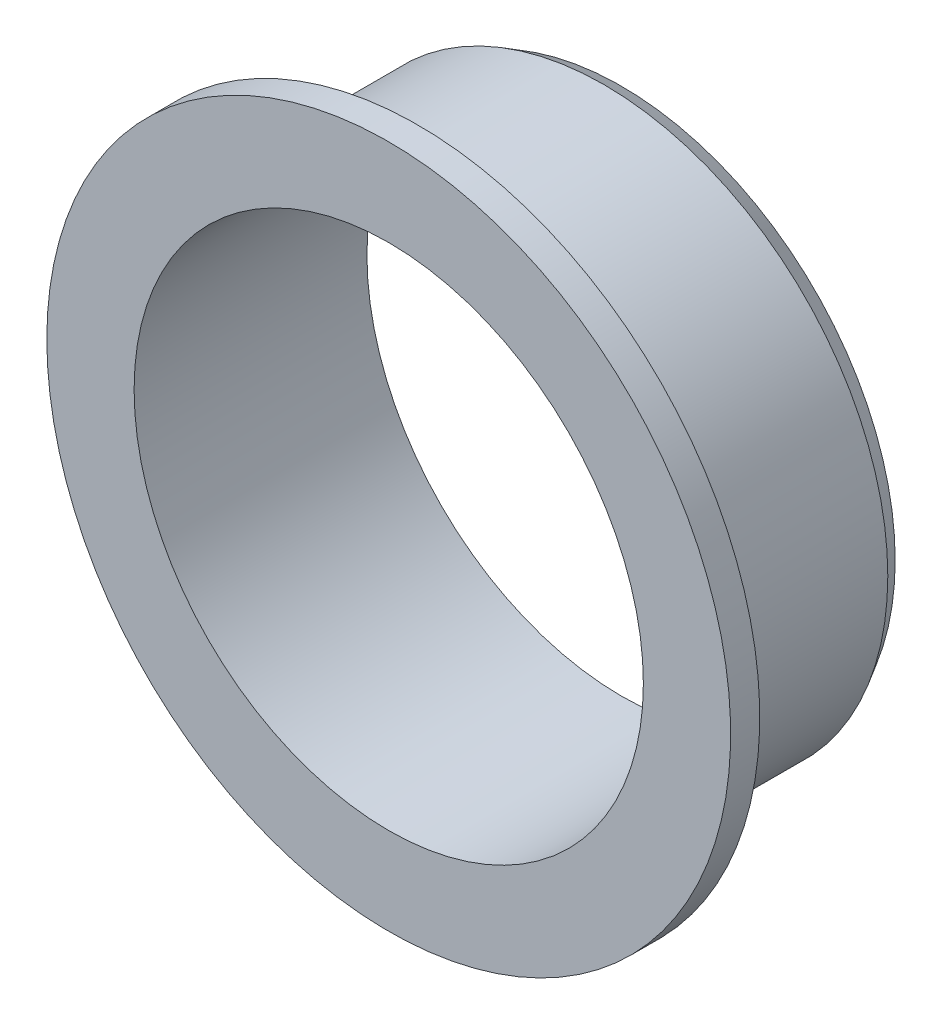
ISO-10303-21;
HEADER;
FILE_DESCRIPTION(('STEP AP214'),'2;1');
FILE_NAME('part.step','',(''),(''),'','','');
FILE_SCHEMA(('AUTOMOTIVE_DESIGN { 1 0 10303 214 1 1 1 1 }'));
ENDSEC;
DATA;
#1=APPLICATION_CONTEXT('core data for automotive mechanical design processes');
#2=APPLICATION_PROTOCOL_DEFINITION('international standard','automotive_design',2000,#1);
#3=PRODUCT_CONTEXT('',#1,'mechanical');
#4=PRODUCT('Part','Part','',(#3));
#5=PRODUCT_RELATED_PRODUCT_CATEGORY('part','',(#4));
#6=PRODUCT_DEFINITION_FORMATION('','',#4);
#7=PRODUCT_DEFINITION_CONTEXT('part definition',#1,'design');
#8=PRODUCT_DEFINITION('design','',#6,#7);
#9=PRODUCT_DEFINITION_SHAPE('','',#8);
#10=(LENGTH_UNIT() NAMED_UNIT(*) SI_UNIT(.MILLI.,.METRE.));
#11=(NAMED_UNIT(*) PLANE_ANGLE_UNIT() SI_UNIT($,.RADIAN.));
#12=(NAMED_UNIT(*) SI_UNIT($,.STERADIAN.) SOLID_ANGLE_UNIT());
#13=UNCERTAINTY_MEASURE_WITH_UNIT(LENGTH_MEASURE(1.E-05),#10,'distance_accuracy_value','');
#14=(GEOMETRIC_REPRESENTATION_CONTEXT(3) GLOBAL_UNCERTAINTY_ASSIGNED_CONTEXT((#13)) GLOBAL_UNIT_ASSIGNED_CONTEXT((#10,
#11,#12)) REPRESENTATION_CONTEXT('',''));
#15=CARTESIAN_POINT('',(0.,0.,0.));
#16=DIRECTION('',(0.,0.,1.));
#17=DIRECTION('',(1.,0.,0.));
#18=AXIS2_PLACEMENT_3D('',#15,#16,#17);
#19=CARTESIAN_POINT('',(-196.682719320137,-420.602297752566,-809.23578652296));
#20=DIRECTION('',(0.,0.,-1.));
#21=DIRECTION('',(-1.,0.,0.));
#22=AXIS2_PLACEMENT_3D('',#19,#20,#21);
#23=TOROIDAL_SURFACE('',#22,20.,0.500000000000007);
#24=CARTESIAN_POINT('',(-196.682719320137,-420.602297752566,-808.73578652296));
#25=DIRECTION('',(0.,0.,-1.));
#26=DIRECTION('',(-1.,0.,0.));
#27=AXIS2_PLACEMENT_3D('',#24,#25,#26);
#28=CIRCLE('',#27,20.);
#29=CARTESIAN_POINT('',(-176.682719320137,-420.602297752566,-808.73578652296));
#30=VERTEX_POINT('',#29);
#31=CARTESIAN_POINT('',(-216.682719320137,-420.602297752566,-808.73578652296));
#32=VERTEX_POINT('',#31);
#33=EDGE_CURVE('E38',#30,#32,#28,.F.);
#34=ORIENTED_EDGE('',*,*,#33,.F.);
#35=CARTESIAN_POINT('',(-196.682719320137,-420.602297752566,-808.73578652296));
#36=DIRECTION('',(0.,0.,-1.));
#37=DIRECTION('',(1.,0.,0.));
#38=AXIS2_PLACEMENT_3D('',#35,#36,#37);
#39=CIRCLE('',#38,20.);
#40=EDGE_CURVE('E35',#32,#30,#39,.F.);
#41=ORIENTED_EDGE('',*,*,#40,.F.);
#42=EDGE_LOOP('',(#34,#41));
#43=FACE_BOUND('',#42,.T.);
#44=CARTESIAN_POINT('',(-196.682719320137,-420.602297752566,-809.23578652296));
#45=DIRECTION('',(0.,0.,-1.));
#46=DIRECTION('',(-1.,0.,0.));
#47=AXIS2_PLACEMENT_3D('',#44,#45,#46);
#48=CIRCLE('',#47,19.5);
#49=CARTESIAN_POINT('',(-216.182719320137,-420.602297752566,-809.23578652296));
#50=VERTEX_POINT('',#49);
#51=EDGE_CURVE('E44',#50,#50,#48,.T.);
#52=ORIENTED_EDGE('',*,*,#51,.F.);
#53=EDGE_LOOP('',(#52));
#54=FACE_BOUND('',#53,.T.);
#55=ADVANCED_FACE('F17',(#43,#54),#23,.F.);
#56=CARTESIAN_POINT('',(-218.432719320137,-420.602297752566,-808.735786522959));
#57=DIRECTION('',(0.,0.,-1.));
#58=DIRECTION('',(-1.,0.,0.));
#59=AXIS2_PLACEMENT_3D('',#56,#57,#58);
#60=PLANE('',#59);
#61=ORIENTED_EDGE('',*,*,#40,.T.);
#62=ORIENTED_EDGE('',*,*,#33,.T.);
#63=EDGE_LOOP('',(#61,#62));
#64=FACE_BOUND('',#63,.T.);
#65=CARTESIAN_POINT('',(-196.682719320137,-420.602297752566,-808.735786522959));
#66=DIRECTION('',(0.,0.,-1.));
#67=DIRECTION('',(-1.,0.,0.));
#68=AXIS2_PLACEMENT_3D('',#65,#66,#67);
#69=CIRCLE('',#68,23.5);
#70=CARTESIAN_POINT('',(-220.182719320137,-420.602297752566,-808.735786522959));
#71=VERTEX_POINT('',#70);
#72=EDGE_CURVE('E49',#71,#71,#69,.F.);
#73=ORIENTED_EDGE('',*,*,#72,.F.);
#74=EDGE_LOOP('',(#73));
#75=FACE_BOUND('',#74,.T.);
#76=ADVANCED_FACE('F40',(#64,#75),#60,.T.);
#77=CARTESIAN_POINT('',(-196.682719320137,-420.602297752566,-815.385786522958));
#78=DIRECTION('',(0.,0.,-1.));
#79=DIRECTION('',(-1.,0.,0.));
#80=AXIS2_PLACEMENT_3D('',#77,#78,#79);
#81=CYLINDRICAL_SURFACE('',#80,19.5);
#82=ORIENTED_EDGE('',*,*,#51,.T.);
#83=EDGE_LOOP('',(#82));
#84=FACE_BOUND('',#83,.T.);
#85=CARTESIAN_POINT('',(-196.682719320137,-420.602297752566,-821.535786522959));
#86=DIRECTION('',(0.,0.,1.));
#87=DIRECTION('',(-1.,0.,0.));
#88=AXIS2_PLACEMENT_3D('',#85,#86,#87);
#89=CIRCLE('',#88,19.5000000000002);
#90=CARTESIAN_POINT('',(-216.182719320137,-420.602297752566,-821.535786522959));
#91=VERTEX_POINT('',#90);
#92=EDGE_CURVE('E52',#91,#91,#89,.F.);
#93=ORIENTED_EDGE('',*,*,#92,.F.);
#94=EDGE_LOOP('',(#93));
#95=FACE_BOUND('',#94,.T.);
#96=ADVANCED_FACE('F81',(#84,#95),#81,.T.);
#97=CARTESIAN_POINT('',(-196.682719320137,-420.602297752566,-807.735786522958));
#98=DIRECTION('',(0.,0.,-1.));
#99=DIRECTION('',(-1.,0.,0.));
#100=AXIS2_PLACEMENT_3D('',#97,#98,#99);
#101=CYLINDRICAL_SURFACE('',#100,23.5);
#102=CARTESIAN_POINT('',(-196.682719320137,-420.602297752566,-806.73578652296));
#103=DIRECTION('',(0.,0.,-1.));
#104=DIRECTION('',(-1.,0.,0.));
#105=AXIS2_PLACEMENT_3D('',#102,#103,#104);
#106=CIRCLE('',#105,23.5);
#107=CARTESIAN_POINT('',(-220.182719320137,-420.602297752566,-806.73578652296));
#108=VERTEX_POINT('',#107);
#109=EDGE_CURVE('E53',#108,#108,#106,.F.);
#110=ORIENTED_EDGE('',*,*,#109,.F.);
#111=EDGE_LOOP('',(#110));
#112=FACE_BOUND('',#111,.T.);
#113=ORIENTED_EDGE('',*,*,#72,.T.);
#114=EDGE_LOOP('',(#113));
#115=FACE_BOUND('',#114,.T.);
#116=ADVANCED_FACE('F99',(#112,#115),#101,.T.);
#117=CARTESIAN_POINT('',(-196.682719320137,-420.602297752566,-821.535786522959));
#118=DIRECTION('',(0.,0.,1.));
#119=DIRECTION('',(1.,0.,0.));
#120=AXIS2_PLACEMENT_3D('',#117,#118,#119);
#121=CONICAL_SURFACE('',#120,19.5000000000002,0.523598775598301);
#122=ORIENTED_EDGE('',*,*,#92,.T.);
#123=EDGE_LOOP('',(#122));
#124=FACE_BOUND('',#123,.T.);
#125=CARTESIAN_POINT('',(-196.682719320137,-420.602297752566,-822.735786522959));
#126=DIRECTION('',(0.,0.,1.));
#127=DIRECTION('',(1.,0.,0.));
#128=AXIS2_PLACEMENT_3D('',#125,#126,#127);
#129=CIRCLE('',#128,18.8071796769725);
#130=CARTESIAN_POINT('',(-177.875539643165,-420.602297752566,-822.735786522959));
#131=VERTEX_POINT('',#130);
#132=EDGE_CURVE('E56',#131,#131,#129,.F.);
#133=ORIENTED_EDGE('',*,*,#132,.F.);
#134=EDGE_LOOP('',(#133));
#135=FACE_BOUND('',#134,.T.);
#136=ADVANCED_FACE('F95',(#124,#135),#121,.T.);
#137=CARTESIAN_POINT('',(-217.182719320137,-420.602297752566,-806.73578652296));
#138=DIRECTION('',(0.,0.,1.));
#139=DIRECTION('',(1.,0.,0.));
#140=AXIS2_PLACEMENT_3D('',#137,#138,#139);
#141=PLANE('',#140);
#142=CARTESIAN_POINT('',(-196.682719320137,-420.602297752566,-806.73578652296));
#143=DIRECTION('',(0.,0.,-1.));
#144=DIRECTION('',(-1.,0.,0.));
#145=AXIS2_PLACEMENT_3D('',#142,#143,#144);
#146=CIRCLE('',#145,17.5);
#147=CARTESIAN_POINT('',(-214.182719320137,-420.602297752566,-806.73578652296));
#148=VERTEX_POINT('',#147);
#149=EDGE_CURVE('E28',#148,#148,#146,.T.);
#150=ORIENTED_EDGE('',*,*,#149,.T.);
#151=EDGE_LOOP('',(#150));
#152=FACE_BOUND('',#151,.T.);
#153=ORIENTED_EDGE('',*,*,#109,.T.);
#154=EDGE_LOOP('',(#153));
#155=FACE_BOUND('',#154,.T.);
#156=ADVANCED_FACE('F114',(#152,#155),#141,.T.);
#157=CARTESIAN_POINT('',(-214.836309158624,-420.602297752566,-822.735786522959));
#158=DIRECTION('',(0.,0.,-1.));
#159=DIRECTION('',(-1.,0.,0.));
#160=AXIS2_PLACEMENT_3D('',#157,#158,#159);
#161=PLANE('',#160);
#162=CARTESIAN_POINT('',(-196.682719320137,-420.602297752566,-822.735786522959));
#163=DIRECTION('',(0.,0.,-1.));
#164=DIRECTION('',(-1.,0.,0.));
#165=AXIS2_PLACEMENT_3D('',#162,#163,#164);
#166=CIRCLE('',#165,17.5);
#167=CARTESIAN_POINT('',(-214.182719320137,-420.602297752566,-822.735786522959));
#168=VERTEX_POINT('',#167);
#169=EDGE_CURVE('E11',#168,#168,#166,.F.);
#170=ORIENTED_EDGE('',*,*,#169,.T.);
#171=EDGE_LOOP('',(#170));
#172=FACE_BOUND('',#171,.T.);
#173=ORIENTED_EDGE('',*,*,#132,.T.);
#174=EDGE_LOOP('',(#173));
#175=FACE_BOUND('',#174,.T.);
#176=ADVANCED_FACE('F108',(#172,#175),#161,.T.);
#177=CARTESIAN_POINT('',(-196.682719320137,-420.602297752566,-814.735786522958));
#178=DIRECTION('',(0.,0.,-1.));
#179=DIRECTION('',(-1.,0.,0.));
#180=AXIS2_PLACEMENT_3D('',#177,#178,#179);
#181=CYLINDRICAL_SURFACE('',#180,17.5);
#182=ORIENTED_EDGE('',*,*,#169,.F.);
#183=EDGE_LOOP('',(#182));
#184=FACE_BOUND('',#183,.T.);
#185=ORIENTED_EDGE('',*,*,#149,.F.);
#186=EDGE_LOOP('',(#185));
#187=FACE_BOUND('',#186,.T.);
#188=ADVANCED_FACE('F106',(#184,#187),#181,.F.);
#189=CLOSED_SHELL('',(#55,#76,#96,#116,#136,#156,#176,#188));
#190=MANIFOLD_SOLID_BREP('B1',#189);
#191=ADVANCED_BREP_SHAPE_REPRESENTATION('',(#18,#190),#14);
#192=SHAPE_DEFINITION_REPRESENTATION(#9,#191);
ENDSEC;
END-ISO-10303-21;
